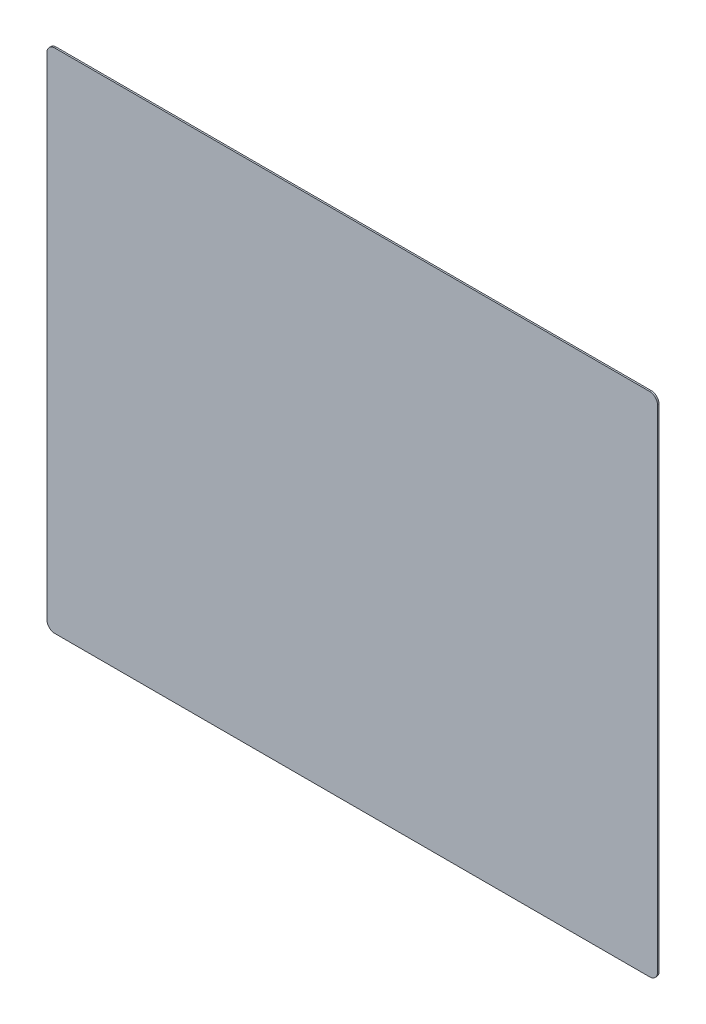
ISO-10303-21;
HEADER;
FILE_DESCRIPTION(('STEP AP214'),'2;1');
FILE_NAME('part.step','',(''),(''),'','','');
FILE_SCHEMA(('AUTOMOTIVE_DESIGN { 1 0 10303 214 1 1 1 1 }'));
ENDSEC;
DATA;
#1=APPLICATION_CONTEXT('core data for automotive mechanical design processes');
#2=APPLICATION_PROTOCOL_DEFINITION('international standard','automotive_design',2000,#1);
#3=PRODUCT_CONTEXT('',#1,'mechanical');
#4=PRODUCT('Part','Part','',(#3));
#5=PRODUCT_RELATED_PRODUCT_CATEGORY('part','',(#4));
#6=PRODUCT_DEFINITION_FORMATION('','',#4);
#7=PRODUCT_DEFINITION_CONTEXT('part definition',#1,'design');
#8=PRODUCT_DEFINITION('design','',#6,#7);
#9=PRODUCT_DEFINITION_SHAPE('','',#8);
#10=(LENGTH_UNIT() NAMED_UNIT(*) SI_UNIT(.MILLI.,.METRE.));
#11=(NAMED_UNIT(*) PLANE_ANGLE_UNIT() SI_UNIT($,.RADIAN.));
#12=(NAMED_UNIT(*) SI_UNIT($,.STERADIAN.) SOLID_ANGLE_UNIT());
#13=UNCERTAINTY_MEASURE_WITH_UNIT(LENGTH_MEASURE(1.E-05),#10,'distance_accuracy_value','');
#14=(GEOMETRIC_REPRESENTATION_CONTEXT(3) GLOBAL_UNCERTAINTY_ASSIGNED_CONTEXT((#13)) GLOBAL_UNIT_ASSIGNED_CONTEXT((#10,
#11,#12)) REPRESENTATION_CONTEXT('',''));
#15=CARTESIAN_POINT('',(0.,0.,0.));
#16=DIRECTION('',(0.,0.,1.));
#17=DIRECTION('',(1.,0.,0.));
#18=AXIS2_PLACEMENT_3D('',#15,#16,#17);
#19=CARTESIAN_POINT('',(-0.575,-0.49,0.45));
#20=DIRECTION('',(0.,-1.,0.));
#21=DIRECTION('',(1.,0.,0.));
#22=AXIS2_PLACEMENT_3D('',#19,#20,#21);
#23=PLANE('',#22);
#24=DIRECTION('',(1.,0.,0.));
#25=VECTOR('',#24,1.);
#26=CARTESIAN_POINT('',(-0.575,-0.49,0.45));
#27=LINE('',#26,#25);
#28=CARTESIAN_POINT('',(-0.575,-0.49,0.45));
#29=VERTEX_POINT('',#28);
#30=CARTESIAN_POINT('',(0.575,-0.49,0.45));
#31=VERTEX_POINT('',#30);
#32=EDGE_CURVE('E11',#29,#31,#27,.T.);
#33=ORIENTED_EDGE('',*,*,#32,.T.);
#34=DIRECTION('',(0.,0.,1.));
#35=VECTOR('',#34,1.);
#36=CARTESIAN_POINT('',(0.575,-0.49,0.45));
#37=LINE('',#36,#35);
#38=CARTESIAN_POINT('',(0.575,-0.49,0.453));
#39=VERTEX_POINT('',#38);
#40=EDGE_CURVE('E24',#31,#39,#37,.T.);
#41=ORIENTED_EDGE('',*,*,#40,.T.);
#42=DIRECTION('',(1.,0.,0.));
#43=VECTOR('',#42,1.);
#44=CARTESIAN_POINT('',(-0.575,-0.49,0.453));
#45=LINE('',#44,#43);
#46=CARTESIAN_POINT('',(-0.575,-0.49,0.453));
#47=VERTEX_POINT('',#46);
#48=EDGE_CURVE('E100',#47,#39,#45,.T.);
#49=ORIENTED_EDGE('',*,*,#48,.F.);
#50=DIRECTION('',(0.,0.,1.));
#51=VECTOR('',#50,1.);
#52=CARTESIAN_POINT('',(-0.575,-0.49,0.45));
#53=LINE('',#52,#51);
#54=EDGE_CURVE('E146',#29,#47,#53,.T.);
#55=ORIENTED_EDGE('',*,*,#54,.F.);
#56=EDGE_LOOP('',(#33,#41,#49,#55));
#57=FACE_BOUND('',#56,.T.);
#58=ADVANCED_FACE('F17',(#57),#23,.T.);
#59=CARTESIAN_POINT('',(-0.575,-0.475,0.45));
#60=DIRECTION('',(0.,0.,1.));
#61=DIRECTION('',(-1.,0.,0.));
#62=AXIS2_PLACEMENT_3D('',#59,#60,#61);
#63=CYLINDRICAL_SURFACE('',#62,0.0149999999999999);
#64=CARTESIAN_POINT('',(-0.575,-0.475,0.45));
#65=DIRECTION('',(0.,0.,1.));
#66=DIRECTION('',(-1.,0.,0.));
#67=AXIS2_PLACEMENT_3D('',#64,#65,#66);
#68=CIRCLE('',#67,0.0149999999999999);
#69=CARTESIAN_POINT('',(-0.59,-0.475,0.45));
#70=VERTEX_POINT('',#69);
#71=EDGE_CURVE('E143',#70,#29,#68,.T.);
#72=ORIENTED_EDGE('',*,*,#71,.T.);
#73=ORIENTED_EDGE('',*,*,#54,.T.);
#74=CARTESIAN_POINT('',(-0.575,-0.475,0.453));
#75=DIRECTION('',(0.,0.,1.));
#76=DIRECTION('',(-1.,0.,0.));
#77=AXIS2_PLACEMENT_3D('',#74,#75,#76);
#78=CIRCLE('',#77,0.0149999999999999);
#79=CARTESIAN_POINT('',(-0.59,-0.475,0.453));
#80=VERTEX_POINT('',#79);
#81=EDGE_CURVE('E141',#80,#47,#78,.T.);
#82=ORIENTED_EDGE('',*,*,#81,.F.);
#83=DIRECTION('',(0.,0.,1.));
#84=VECTOR('',#83,1.);
#85=CARTESIAN_POINT('',(-0.59,-0.475,0.45));
#86=LINE('',#85,#84);
#87=EDGE_CURVE('E138',#70,#80,#86,.T.);
#88=ORIENTED_EDGE('',*,*,#87,.F.);
#89=EDGE_LOOP('',(#72,#73,#82,#88));
#90=FACE_BOUND('',#89,.T.);
#91=ADVANCED_FACE('F163',(#90),#63,.T.);
#92=CARTESIAN_POINT('',(-0.59,0.475,0.45));
#93=DIRECTION('',(-1.,0.,0.));
#94=DIRECTION('',(0.,-1.,0.));
#95=AXIS2_PLACEMENT_3D('',#92,#93,#94);
#96=PLANE('',#95);
#97=DIRECTION('',(0.,-1.,0.));
#98=VECTOR('',#97,1.);
#99=CARTESIAN_POINT('',(-0.59,0.475,0.45));
#100=LINE('',#99,#98);
#101=CARTESIAN_POINT('',(-0.59,0.475,0.45));
#102=VERTEX_POINT('',#101);
#103=EDGE_CURVE('E135',#102,#70,#100,.T.);
#104=ORIENTED_EDGE('',*,*,#103,.T.);
#105=ORIENTED_EDGE('',*,*,#87,.T.);
#106=DIRECTION('',(0.,-1.,0.));
#107=VECTOR('',#106,1.);
#108=CARTESIAN_POINT('',(-0.59,0.475,0.453));
#109=LINE('',#108,#107);
#110=CARTESIAN_POINT('',(-0.59,0.475,0.453));
#111=VERTEX_POINT('',#110);
#112=EDGE_CURVE('E132',#111,#80,#109,.T.);
#113=ORIENTED_EDGE('',*,*,#112,.F.);
#114=DIRECTION('',(0.,0.,1.));
#115=VECTOR('',#114,1.);
#116=CARTESIAN_POINT('',(-0.59,0.475,0.45));
#117=LINE('',#116,#115);
#118=EDGE_CURVE('E129',#102,#111,#117,.T.);
#119=ORIENTED_EDGE('',*,*,#118,.F.);
#120=EDGE_LOOP('',(#104,#105,#113,#119));
#121=FACE_BOUND('',#120,.T.);
#122=ADVANCED_FACE('F160',(#121),#96,.T.);
#123=CARTESIAN_POINT('',(-0.575,0.475,0.45));
#124=DIRECTION('',(0.,0.,1.));
#125=DIRECTION('',(0.,1.,0.));
#126=AXIS2_PLACEMENT_3D('',#123,#124,#125);
#127=CYLINDRICAL_SURFACE('',#126,0.015);
#128=CARTESIAN_POINT('',(-0.575,0.475,0.45));
#129=DIRECTION('',(0.,0.,1.));
#130=DIRECTION('',(0.,1.,0.));
#131=AXIS2_PLACEMENT_3D('',#128,#129,#130);
#132=CIRCLE('',#131,0.015);
#133=CARTESIAN_POINT('',(-0.575,0.49,0.45));
#134=VERTEX_POINT('',#133);
#135=EDGE_CURVE('E126',#134,#102,#132,.T.);
#136=ORIENTED_EDGE('',*,*,#135,.T.);
#137=ORIENTED_EDGE('',*,*,#118,.T.);
#138=CARTESIAN_POINT('',(-0.575,0.475,0.453));
#139=DIRECTION('',(0.,0.,1.));
#140=DIRECTION('',(0.,1.,0.));
#141=AXIS2_PLACEMENT_3D('',#138,#139,#140);
#142=CIRCLE('',#141,0.015);
#143=CARTESIAN_POINT('',(-0.575,0.49,0.453));
#144=VERTEX_POINT('',#143);
#145=EDGE_CURVE('E123',#144,#111,#142,.T.);
#146=ORIENTED_EDGE('',*,*,#145,.F.);
#147=DIRECTION('',(0.,0.,1.));
#148=VECTOR('',#147,1.);
#149=CARTESIAN_POINT('',(-0.575,0.49,0.45));
#150=LINE('',#149,#148);
#151=EDGE_CURVE('E120',#134,#144,#150,.T.);
#152=ORIENTED_EDGE('',*,*,#151,.F.);
#153=EDGE_LOOP('',(#136,#137,#146,#152));
#154=FACE_BOUND('',#153,.T.);
#155=ADVANCED_FACE('F157',(#154),#127,.T.);
#156=CARTESIAN_POINT('',(0.575,0.49,0.45));
#157=DIRECTION('',(0.,1.,0.));
#158=DIRECTION('',(-1.,0.,0.));
#159=AXIS2_PLACEMENT_3D('',#156,#157,#158);
#160=PLANE('',#159);
#161=DIRECTION('',(-1.,0.,0.));
#162=VECTOR('',#161,1.);
#163=CARTESIAN_POINT('',(0.575,0.49,0.45));
#164=LINE('',#163,#162);
#165=CARTESIAN_POINT('',(0.575,0.49,0.45));
#166=VERTEX_POINT('',#165);
#167=EDGE_CURVE('E117',#166,#134,#164,.T.);
#168=ORIENTED_EDGE('',*,*,#167,.T.);
#169=ORIENTED_EDGE('',*,*,#151,.T.);
#170=DIRECTION('',(-1.,0.,0.));
#171=VECTOR('',#170,1.);
#172=CARTESIAN_POINT('',(0.575,0.49,0.453));
#173=LINE('',#172,#171);
#174=CARTESIAN_POINT('',(0.575,0.49,0.453));
#175=VERTEX_POINT('',#174);
#176=EDGE_CURVE('E114',#175,#144,#173,.T.);
#177=ORIENTED_EDGE('',*,*,#176,.F.);
#178=DIRECTION('',(0.,0.,1.));
#179=VECTOR('',#178,1.);
#180=CARTESIAN_POINT('',(0.575,0.49,0.45));
#181=LINE('',#180,#179);
#182=EDGE_CURVE('E111',#166,#175,#181,.T.);
#183=ORIENTED_EDGE('',*,*,#182,.F.);
#184=EDGE_LOOP('',(#168,#169,#177,#183));
#185=FACE_BOUND('',#184,.T.);
#186=ADVANCED_FACE('F154',(#185),#160,.T.);
#187=CARTESIAN_POINT('',(0.575,0.475,0.45));
#188=DIRECTION('',(0.,0.,1.));
#189=DIRECTION('',(1.,0.,0.));
#190=AXIS2_PLACEMENT_3D('',#187,#188,#189);
#191=CYLINDRICAL_SURFACE('',#190,0.0149999999999999);
#192=CARTESIAN_POINT('',(0.575,0.475,0.45));
#193=DIRECTION('',(0.,0.,1.));
#194=DIRECTION('',(1.,0.,0.));
#195=AXIS2_PLACEMENT_3D('',#192,#193,#194);
#196=CIRCLE('',#195,0.0149999999999999);
#197=CARTESIAN_POINT('',(0.59,0.475,0.45));
#198=VERTEX_POINT('',#197);
#199=EDGE_CURVE('E108',#198,#166,#196,.T.);
#200=ORIENTED_EDGE('',*,*,#199,.T.);
#201=ORIENTED_EDGE('',*,*,#182,.T.);
#202=CARTESIAN_POINT('',(0.575,0.475,0.453));
#203=DIRECTION('',(0.,0.,1.));
#204=DIRECTION('',(1.,0.,0.));
#205=AXIS2_PLACEMENT_3D('',#202,#203,#204);
#206=CIRCLE('',#205,0.0149999999999999);
#207=CARTESIAN_POINT('',(0.59,0.475,0.453));
#208=VERTEX_POINT('',#207);
#209=EDGE_CURVE('E106',#208,#175,#206,.T.);
#210=ORIENTED_EDGE('',*,*,#209,.F.);
#211=DIRECTION('',(0.,0.,1.));
#212=VECTOR('',#211,1.);
#213=CARTESIAN_POINT('',(0.59,0.475,0.45));
#214=LINE('',#213,#212);
#215=EDGE_CURVE('E85',#198,#208,#214,.T.);
#216=ORIENTED_EDGE('',*,*,#215,.F.);
#217=EDGE_LOOP('',(#200,#201,#210,#216));
#218=FACE_BOUND('',#217,.T.);
#219=ADVANCED_FACE('F152',(#218),#191,.T.);
#220=CARTESIAN_POINT('',(0.59,-0.475,0.45));
#221=DIRECTION('',(1.,0.,0.));
#222=DIRECTION('',(0.,1.,0.));
#223=AXIS2_PLACEMENT_3D('',#220,#221,#222);
#224=PLANE('',#223);
#225=DIRECTION('',(0.,1.,0.));
#226=VECTOR('',#225,1.);
#227=CARTESIAN_POINT('',(0.59,-0.475,0.45));
#228=LINE('',#227,#226);
#229=CARTESIAN_POINT('',(0.59,-0.475,0.45));
#230=VERTEX_POINT('',#229);
#231=EDGE_CURVE('E89',#230,#198,#228,.T.);
#232=ORIENTED_EDGE('',*,*,#231,.T.);
#233=ORIENTED_EDGE('',*,*,#215,.T.);
#234=DIRECTION('',(0.,1.,0.));
#235=VECTOR('',#234,1.);
#236=CARTESIAN_POINT('',(0.59,-0.475,0.453));
#237=LINE('',#236,#235);
#238=CARTESIAN_POINT('',(0.59,-0.475,0.453));
#239=VERTEX_POINT('',#238);
#240=EDGE_CURVE('E78',#239,#208,#237,.T.);
#241=ORIENTED_EDGE('',*,*,#240,.F.);
#242=DIRECTION('',(0.,0.,1.));
#243=VECTOR('',#242,1.);
#244=CARTESIAN_POINT('',(0.59,-0.475,0.45));
#245=LINE('',#244,#243);
#246=EDGE_CURVE('E82',#230,#239,#245,.T.);
#247=ORIENTED_EDGE('',*,*,#246,.F.);
#248=EDGE_LOOP('',(#232,#233,#241,#247));
#249=FACE_BOUND('',#248,.T.);
#250=ADVANCED_FACE('F81',(#249),#224,.T.);
#251=CARTESIAN_POINT('',(0.575,-0.475,0.45));
#252=DIRECTION('',(0.,0.,1.));
#253=DIRECTION('',(0.,-1.,0.));
#254=AXIS2_PLACEMENT_3D('',#251,#252,#253);
#255=CYLINDRICAL_SURFACE('',#254,0.015);
#256=CARTESIAN_POINT('',(0.575,-0.475,0.45));
#257=DIRECTION('',(0.,0.,1.));
#258=DIRECTION('',(0.,-1.,0.));
#259=AXIS2_PLACEMENT_3D('',#256,#257,#258);
#260=CIRCLE('',#259,0.015);
#261=EDGE_CURVE('E95',#31,#230,#260,.T.);
#262=ORIENTED_EDGE('',*,*,#261,.T.);
#263=ORIENTED_EDGE('',*,*,#246,.T.);
#264=CARTESIAN_POINT('',(0.575,-0.475,0.453));
#265=DIRECTION('',(0.,0.,1.));
#266=DIRECTION('',(0.,-1.,0.));
#267=AXIS2_PLACEMENT_3D('',#264,#265,#266);
#268=CIRCLE('',#267,0.015);
#269=EDGE_CURVE('E94',#39,#239,#268,.T.);
#270=ORIENTED_EDGE('',*,*,#269,.F.);
#271=ORIENTED_EDGE('',*,*,#40,.F.);
#272=EDGE_LOOP('',(#262,#263,#270,#271));
#273=FACE_BOUND('',#272,.T.);
#274=ADVANCED_FACE('F93',(#273),#255,.T.);
#275=CARTESIAN_POINT('',(0.,0.,0.453));
#276=DIRECTION('',(0.,0.,1.));
#277=DIRECTION('',(1.,0.,0.));
#278=AXIS2_PLACEMENT_3D('',#275,#276,#277);
#279=PLANE('',#278);
#280=ORIENTED_EDGE('',*,*,#269,.T.);
#281=ORIENTED_EDGE('',*,*,#240,.T.);
#282=ORIENTED_EDGE('',*,*,#209,.T.);
#283=ORIENTED_EDGE('',*,*,#176,.T.);
#284=ORIENTED_EDGE('',*,*,#145,.T.);
#285=ORIENTED_EDGE('',*,*,#112,.T.);
#286=ORIENTED_EDGE('',*,*,#81,.T.);
#287=ORIENTED_EDGE('',*,*,#48,.T.);
#288=EDGE_LOOP('',(#280,#281,#282,#283,#284,#285,#286,#287));
#289=FACE_BOUND('',#288,.T.);
#290=ADVANCED_FACE('F98',(#289),#279,.T.);
#291=CARTESIAN_POINT('',(0.,0.,0.45));
#292=DIRECTION('',(0.,0.,1.));
#293=DIRECTION('',(1.,0.,0.));
#294=AXIS2_PLACEMENT_3D('',#291,#292,#293);
#295=PLANE('',#294);
#296=ORIENTED_EDGE('',*,*,#261,.F.);
#297=ORIENTED_EDGE('',*,*,#32,.F.);
#298=ORIENTED_EDGE('',*,*,#71,.F.);
#299=ORIENTED_EDGE('',*,*,#103,.F.);
#300=ORIENTED_EDGE('',*,*,#135,.F.);
#301=ORIENTED_EDGE('',*,*,#167,.F.);
#302=ORIENTED_EDGE('',*,*,#199,.F.);
#303=ORIENTED_EDGE('',*,*,#231,.F.);
#304=EDGE_LOOP('',(#296,#297,#298,#299,#300,#301,#302,#303));
#305=FACE_BOUND('',#304,.T.);
#306=ADVANCED_FACE('F149',(#305),#295,.F.);
#307=CLOSED_SHELL('',(#58,#91,#122,#155,#186,#219,#250,#274,#290,#306));
#308=MANIFOLD_SOLID_BREP('B1',#307);
#309=ADVANCED_BREP_SHAPE_REPRESENTATION('',(#18,#308),#14);
#310=SHAPE_DEFINITION_REPRESENTATION(#9,#309);
ENDSEC;
END-ISO-10303-21;
